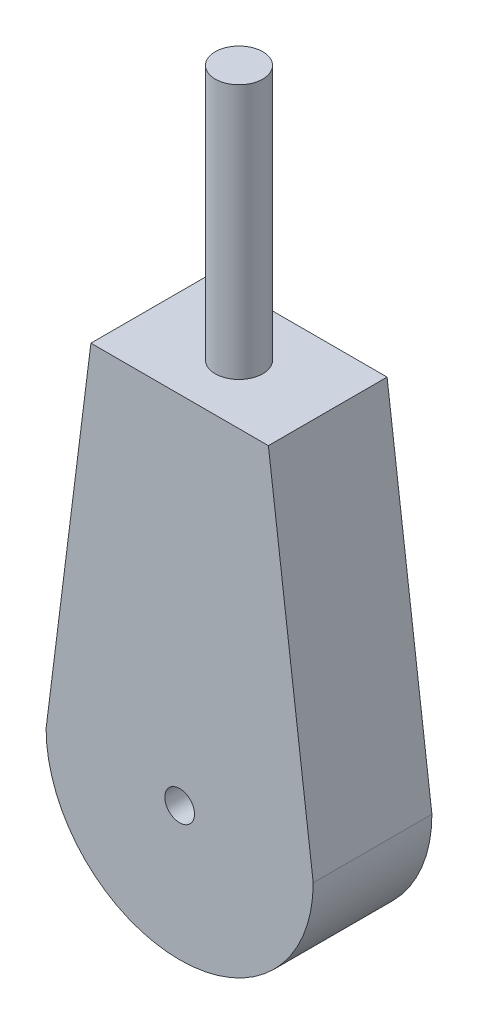
ISO-10303-21;
HEADER;
FILE_DESCRIPTION(('STEP AP214'),'2;1');
FILE_NAME('part.step','',(''),(''),'','','');
FILE_SCHEMA(('AUTOMOTIVE_DESIGN { 1 0 10303 214 1 1 1 1 }'));
ENDSEC;
DATA;
#1=APPLICATION_CONTEXT('core data for automotive mechanical design processes');
#2=APPLICATION_PROTOCOL_DEFINITION('international standard','automotive_design',2000,#1);
#3=PRODUCT_CONTEXT('',#1,'mechanical');
#4=PRODUCT('Part','Part','',(#3));
#5=PRODUCT_RELATED_PRODUCT_CATEGORY('part','',(#4));
#6=PRODUCT_DEFINITION_FORMATION('','',#4);
#7=PRODUCT_DEFINITION_CONTEXT('part definition',#1,'design');
#8=PRODUCT_DEFINITION('design','',#6,#7);
#9=PRODUCT_DEFINITION_SHAPE('','',#8);
#10=(LENGTH_UNIT() NAMED_UNIT(*) SI_UNIT(.MILLI.,.METRE.));
#11=(NAMED_UNIT(*) PLANE_ANGLE_UNIT() SI_UNIT($,.RADIAN.));
#12=(NAMED_UNIT(*) SI_UNIT($,.STERADIAN.) SOLID_ANGLE_UNIT());
#13=UNCERTAINTY_MEASURE_WITH_UNIT(LENGTH_MEASURE(1.E-05),#10,'distance_accuracy_value','');
#14=(GEOMETRIC_REPRESENTATION_CONTEXT(3) GLOBAL_UNCERTAINTY_ASSIGNED_CONTEXT((#13)) GLOBAL_UNIT_ASSIGNED_CONTEXT((#10,
#11,#12)) REPRESENTATION_CONTEXT('',''));
#15=CARTESIAN_POINT('',(0.,0.,0.));
#16=DIRECTION('',(0.,0.,1.));
#17=DIRECTION('',(1.,0.,0.));
#18=AXIS2_PLACEMENT_3D('',#15,#16,#17);
#19=CARTESIAN_POINT('',(0.,0.,10.));
#20=DIRECTION('',(0.,0.,-1.));
#21=DIRECTION('',(-1.,0.,0.));
#22=AXIS2_PLACEMENT_3D('',#19,#20,#21);
#23=CYLINDRICAL_SURFACE('',#22,22.5);
#24=CARTESIAN_POINT('',(0.,0.,-10.));
#25=DIRECTION('',(0.,0.,1.));
#26=DIRECTION('',(1.,0.,0.));
#27=AXIS2_PLACEMENT_3D('',#24,#25,#26);
#28=CIRCLE('',#27,22.5);
#29=CARTESIAN_POINT('',(-22.5,0.,-10.));
#30=VERTEX_POINT('',#29);
#31=CARTESIAN_POINT('',(22.5,0.,-10.));
#32=VERTEX_POINT('',#31);
#33=EDGE_CURVE('E101',#30,#32,#28,.T.);
#34=ORIENTED_EDGE('',*,*,#33,.T.);
#35=DIRECTION('',(0.,0.,-1.));
#36=VECTOR('',#35,1.);
#37=CARTESIAN_POINT('',(22.5,0.,10.));
#38=LINE('',#37,#36);
#39=CARTESIAN_POINT('',(22.5,0.,10.));
#40=VERTEX_POINT('',#39);
#41=EDGE_CURVE('E92',#40,#32,#38,.T.);
#42=ORIENTED_EDGE('',*,*,#41,.F.);
#43=CARTESIAN_POINT('',(0.,0.,10.));
#44=DIRECTION('',(0.,0.,1.));
#45=DIRECTION('',(1.,0.,0.));
#46=AXIS2_PLACEMENT_3D('',#43,#44,#45);
#47=CIRCLE('',#46,22.5);
#48=CARTESIAN_POINT('',(-22.5,0.,10.));
#49=VERTEX_POINT('',#48);
#50=EDGE_CURVE('E86',#49,#40,#47,.T.);
#51=ORIENTED_EDGE('',*,*,#50,.F.);
#52=DIRECTION('',(0.,0.,-1.));
#53=VECTOR('',#52,1.);
#54=CARTESIAN_POINT('',(-22.5,0.,10.));
#55=LINE('',#54,#53);
#56=EDGE_CURVE('E97',#49,#30,#55,.T.);
#57=ORIENTED_EDGE('',*,*,#56,.T.);
#58=EDGE_LOOP('',(#34,#42,#51,#57));
#59=FACE_BOUND('',#58,.T.);
#60=ADVANCED_FACE('F34',(#59),#23,.T.);
#61=CARTESIAN_POINT('',(22.5,0.,10.));
#62=DIRECTION('',(-0.992175781142546,-0.12484878579377,0.));
#63=DIRECTION('',(0.12484878579377,-0.992175781142546,0.));
#64=AXIS2_PLACEMENT_3D('',#61,#62,#63);
#65=PLANE('',#64);
#66=DIRECTION('',(-0.12484878579377,0.992175781142546,0.));
#67=VECTOR('',#66,1.);
#68=CARTESIAN_POINT('',(22.5,0.,-10.));
#69=LINE('',#68,#67);
#70=CARTESIAN_POINT('',(14.95,60.,-10.));
#71=VERTEX_POINT('',#70);
#72=EDGE_CURVE('E91',#32,#71,#69,.T.);
#73=ORIENTED_EDGE('',*,*,#72,.T.);
#74=DIRECTION('',(0.,0.,-1.));
#75=VECTOR('',#74,1.);
#76=CARTESIAN_POINT('',(14.95,60.,10.));
#77=LINE('',#76,#75);
#78=CARTESIAN_POINT('',(14.95,60.,10.));
#79=VERTEX_POINT('',#78);
#80=EDGE_CURVE('E89',#79,#71,#77,.T.);
#81=ORIENTED_EDGE('',*,*,#80,.F.);
#82=DIRECTION('',(-0.12484878579377,0.992175781142546,0.));
#83=VECTOR('',#82,1.);
#84=CARTESIAN_POINT('',(22.5,0.,10.));
#85=LINE('',#84,#83);
#86=EDGE_CURVE('E81',#40,#79,#85,.T.);
#87=ORIENTED_EDGE('',*,*,#86,.F.);
#88=ORIENTED_EDGE('',*,*,#41,.T.);
#89=EDGE_LOOP('',(#73,#81,#87,#88));
#90=FACE_BOUND('',#89,.T.);
#91=ADVANCED_FACE('F90',(#90),#65,.F.);
#92=CARTESIAN_POINT('',(-14.95,60.,10.));
#93=DIRECTION('',(0.,-1.,0.));
#94=DIRECTION('',(0.,0.,-1.));
#95=AXIS2_PLACEMENT_3D('',#92,#93,#94);
#96=PLANE('',#95);
#97=CARTESIAN_POINT('',(0.,60.,0.));
#98=DIRECTION('',(0.,1.,0.));
#99=DIRECTION('',(0.,0.,1.));
#100=AXIS2_PLACEMENT_3D('',#97,#98,#99);
#101=CIRCLE('',#100,4.);
#102=CARTESIAN_POINT('',(0.,60.,4.));
#103=VERTEX_POINT('',#102);
#104=EDGE_CURVE('E42',#103,#103,#101,.T.);
#105=ORIENTED_EDGE('',*,*,#104,.F.);
#106=EDGE_LOOP('',(#105));
#107=FACE_BOUND('',#106,.T.);
#108=DIRECTION('',(-1.,0.,0.));
#109=VECTOR('',#108,1.);
#110=CARTESIAN_POINT('',(-14.95,60.,-10.));
#111=LINE('',#110,#109);
#112=CARTESIAN_POINT('',(-14.95,60.,-10.));
#113=VERTEX_POINT('',#112);
#114=EDGE_CURVE('E67',#71,#113,#111,.T.);
#115=ORIENTED_EDGE('',*,*,#114,.T.);
#116=DIRECTION('',(0.,0.,-1.));
#117=VECTOR('',#116,1.);
#118=CARTESIAN_POINT('',(-14.95,60.,10.));
#119=LINE('',#118,#117);
#120=CARTESIAN_POINT('',(-14.95,60.,10.));
#121=VERTEX_POINT('',#120);
#122=EDGE_CURVE('E93',#121,#113,#119,.T.);
#123=ORIENTED_EDGE('',*,*,#122,.F.);
#124=DIRECTION('',(-1.,0.,0.));
#125=VECTOR('',#124,1.);
#126=CARTESIAN_POINT('',(-14.95,60.,10.));
#127=LINE('',#126,#125);
#128=EDGE_CURVE('E84',#79,#121,#127,.T.);
#129=ORIENTED_EDGE('',*,*,#128,.F.);
#130=ORIENTED_EDGE('',*,*,#80,.T.);
#131=EDGE_LOOP('',(#115,#123,#129,#130));
#132=FACE_BOUND('',#131,.T.);
#133=ADVANCED_FACE('F95',(#107,#132),#96,.F.);
#134=CARTESIAN_POINT('',(-22.5,0.,10.));
#135=DIRECTION('',(0.992175781142546,-0.12484878579377,0.));
#136=DIRECTION('',(0.12484878579377,0.992175781142546,0.));
#137=AXIS2_PLACEMENT_3D('',#134,#135,#136);
#138=PLANE('',#137);
#139=DIRECTION('',(-0.12484878579377,-0.992175781142546,0.));
#140=VECTOR('',#139,1.);
#141=CARTESIAN_POINT('',(-22.5,0.,-10.));
#142=LINE('',#141,#140);
#143=EDGE_CURVE('E73',#113,#30,#142,.T.);
#144=ORIENTED_EDGE('',*,*,#143,.T.);
#145=ORIENTED_EDGE('',*,*,#56,.F.);
#146=DIRECTION('',(-0.12484878579377,-0.992175781142546,0.));
#147=VECTOR('',#146,1.);
#148=CARTESIAN_POINT('',(-22.5,0.,10.));
#149=LINE('',#148,#147);
#150=EDGE_CURVE('E50',#121,#49,#149,.T.);
#151=ORIENTED_EDGE('',*,*,#150,.F.);
#152=ORIENTED_EDGE('',*,*,#122,.T.);
#153=EDGE_LOOP('',(#144,#145,#151,#152));
#154=FACE_BOUND('',#153,.T.);
#155=ADVANCED_FACE('F160',(#154),#138,.F.);
#156=CARTESIAN_POINT('',(0.,0.,10.));
#157=DIRECTION('',(0.,0.,1.));
#158=DIRECTION('',(1.,0.,0.));
#159=AXIS2_PLACEMENT_3D('',#156,#157,#158);
#160=PLANE('',#159);
#161=CARTESIAN_POINT('',(0.,0.,10.));
#162=DIRECTION('',(0.,0.,1.));
#163=DIRECTION('',(1.,0.,0.));
#164=AXIS2_PLACEMENT_3D('',#161,#162,#163);
#165=CIRCLE('',#164,2.5);
#166=CARTESIAN_POINT('',(2.5,0.,10.));
#167=VERTEX_POINT('',#166);
#168=EDGE_CURVE('E117',#167,#167,#165,.T.);
#169=ORIENTED_EDGE('',*,*,#168,.F.);
#170=EDGE_LOOP('',(#169));
#171=FACE_BOUND('',#170,.T.);
#172=ORIENTED_EDGE('',*,*,#50,.T.);
#173=ORIENTED_EDGE('',*,*,#86,.T.);
#174=ORIENTED_EDGE('',*,*,#128,.T.);
#175=ORIENTED_EDGE('',*,*,#150,.T.);
#176=EDGE_LOOP('',(#172,#173,#174,#175));
#177=FACE_BOUND('',#176,.T.);
#178=ADVANCED_FACE('F82',(#171,#177),#160,.T.);
#179=CARTESIAN_POINT('',(0.,0.,-10.));
#180=DIRECTION('',(0.,0.,1.));
#181=DIRECTION('',(1.,0.,0.));
#182=AXIS2_PLACEMENT_3D('',#179,#180,#181);
#183=PLANE('',#182);
#184=CARTESIAN_POINT('',(0.,0.,-10.));
#185=DIRECTION('',(0.,0.,1.));
#186=DIRECTION('',(1.,0.,0.));
#187=AXIS2_PLACEMENT_3D('',#184,#185,#186);
#188=CIRCLE('',#187,12.5);
#189=CARTESIAN_POINT('',(12.5,0.,-10.));
#190=VERTEX_POINT('',#189);
#191=EDGE_CURVE('E11',#190,#190,#188,.F.);
#192=ORIENTED_EDGE('',*,*,#191,.F.);
#193=EDGE_LOOP('',(#192));
#194=FACE_BOUND('',#193,.T.);
#195=ORIENTED_EDGE('',*,*,#33,.F.);
#196=ORIENTED_EDGE('',*,*,#143,.F.);
#197=ORIENTED_EDGE('',*,*,#114,.F.);
#198=ORIENTED_EDGE('',*,*,#72,.F.);
#199=EDGE_LOOP('',(#195,#196,#197,#198));
#200=FACE_BOUND('',#199,.T.);
#201=ADVANCED_FACE('F153',(#194,#200),#183,.F.);
#202=CARTESIAN_POINT('',(0.,103.,0.));
#203=DIRECTION('',(0.,-1.,0.));
#204=DIRECTION('',(0.,0.,-1.));
#205=AXIS2_PLACEMENT_3D('',#202,#203,#204);
#206=CYLINDRICAL_SURFACE('',#205,4.);
#207=CARTESIAN_POINT('',(0.,103.,0.));
#208=DIRECTION('',(0.,1.,0.));
#209=DIRECTION('',(0.,0.,1.));
#210=AXIS2_PLACEMENT_3D('',#207,#208,#209);
#211=CIRCLE('',#210,4.);
#212=CARTESIAN_POINT('',(0.,103.,4.));
#213=VERTEX_POINT('',#212);
#214=EDGE_CURVE('E104',#213,#213,#211,.T.);
#215=ORIENTED_EDGE('',*,*,#214,.F.);
#216=EDGE_LOOP('',(#215));
#217=FACE_BOUND('',#216,.T.);
#218=ORIENTED_EDGE('',*,*,#104,.T.);
#219=EDGE_LOOP('',(#218));
#220=FACE_BOUND('',#219,.T.);
#221=ADVANCED_FACE('F156',(#217,#220),#206,.T.);
#222=CARTESIAN_POINT('',(0.,103.,0.));
#223=DIRECTION('',(0.,1.,0.));
#224=DIRECTION('',(0.,0.,1.));
#225=AXIS2_PLACEMENT_3D('',#222,#223,#224);
#226=PLANE('',#225);
#227=ORIENTED_EDGE('',*,*,#214,.T.);
#228=EDGE_LOOP('',(#227));
#229=FACE_BOUND('',#228,.T.);
#230=ADVANCED_FACE('F192',(#229),#226,.T.);
#231=CARTESIAN_POINT('',(0.,0.,5.));
#232=DIRECTION('',(0.,0.,1.));
#233=DIRECTION('',(1.,0.,0.));
#234=AXIS2_PLACEMENT_3D('',#231,#232,#233);
#235=CYLINDRICAL_SURFACE('',#234,2.5);
#236=CARTESIAN_POINT('',(0.,0.,5.));
#237=DIRECTION('',(0.,0.,1.));
#238=DIRECTION('',(1.,0.,0.));
#239=AXIS2_PLACEMENT_3D('',#236,#237,#238);
#240=CIRCLE('',#239,2.5);
#241=CARTESIAN_POINT('',(2.5,0.,5.));
#242=VERTEX_POINT('',#241);
#243=EDGE_CURVE('E116',#242,#242,#240,.T.);
#244=ORIENTED_EDGE('',*,*,#243,.F.);
#245=EDGE_LOOP('',(#244));
#246=FACE_BOUND('',#245,.T.);
#247=ORIENTED_EDGE('',*,*,#168,.T.);
#248=EDGE_LOOP('',(#247));
#249=FACE_BOUND('',#248,.T.);
#250=ADVANCED_FACE('F203',(#246,#249),#235,.F.);
#251=CARTESIAN_POINT('',(0.,0.,5.));
#252=DIRECTION('',(0.,0.,1.));
#253=DIRECTION('',(1.,0.,0.));
#254=AXIS2_PLACEMENT_3D('',#251,#252,#253);
#255=PLANE('',#254);
#256=ORIENTED_EDGE('',*,*,#243,.T.);
#257=EDGE_LOOP('',(#256));
#258=FACE_BOUND('',#257,.T.);
#259=ADVANCED_FACE('F149',(#258),#255,.T.);
#260=CARTESIAN_POINT('',(0.,0.,-15.));
#261=DIRECTION('',(0.,0.,1.));
#262=DIRECTION('',(1.,0.,0.));
#263=AXIS2_PLACEMENT_3D('',#260,#261,#262);
#264=CYLINDRICAL_SURFACE('',#263,12.5);
#265=CARTESIAN_POINT('',(0.,0.,-15.));
#266=DIRECTION('',(0.,0.,-1.));
#267=DIRECTION('',(-1.,0.,0.));
#268=AXIS2_PLACEMENT_3D('',#265,#266,#267);
#269=CIRCLE('',#268,12.5);
#270=CARTESIAN_POINT('',(-12.5,0.,-15.));
#271=VERTEX_POINT('',#270);
#272=EDGE_CURVE('E120',#271,#271,#269,.T.);
#273=ORIENTED_EDGE('',*,*,#272,.F.);
#274=EDGE_LOOP('',(#273));
#275=FACE_BOUND('',#274,.T.);
#276=ORIENTED_EDGE('',*,*,#191,.T.);
#277=EDGE_LOOP('',(#276));
#278=FACE_BOUND('',#277,.T.);
#279=ADVANCED_FACE('F143',(#275,#278),#264,.T.);
#280=CARTESIAN_POINT('',(0.,0.,-15.));
#281=DIRECTION('',(0.,0.,-1.));
#282=DIRECTION('',(-1.,0.,0.));
#283=AXIS2_PLACEMENT_3D('',#280,#281,#282);
#284=PLANE('',#283);
#285=CARTESIAN_POINT('',(0.,0.,-15.));
#286=DIRECTION('',(0.,0.,-1.));
#287=DIRECTION('',(-1.,0.,0.));
#288=AXIS2_PLACEMENT_3D('',#285,#286,#287);
#289=CIRCLE('',#288,2.5);
#290=CARTESIAN_POINT('',(-2.5,0.,-15.));
#291=VERTEX_POINT('',#290);
#292=EDGE_CURVE('E126',#291,#291,#289,.T.);
#293=ORIENTED_EDGE('',*,*,#292,.F.);
#294=EDGE_LOOP('',(#293));
#295=FACE_BOUND('',#294,.T.);
#296=ORIENTED_EDGE('',*,*,#272,.T.);
#297=EDGE_LOOP('',(#296));
#298=FACE_BOUND('',#297,.T.);
#299=ADVANCED_FACE('F137',(#295,#298),#284,.T.);
#300=CARTESIAN_POINT('',(0.,0.,-10.));
#301=DIRECTION('',(0.,0.,-1.));
#302=DIRECTION('',(-1.,0.,0.));
#303=AXIS2_PLACEMENT_3D('',#300,#301,#302);
#304=CYLINDRICAL_SURFACE('',#303,2.5);
#305=CARTESIAN_POINT('',(0.,0.,-10.));
#306=DIRECTION('',(0.,0.,-1.));
#307=DIRECTION('',(-1.,0.,0.));
#308=AXIS2_PLACEMENT_3D('',#305,#306,#307);
#309=CIRCLE('',#308,2.5);
#310=CARTESIAN_POINT('',(-2.5,0.,-10.));
#311=VERTEX_POINT('',#310);
#312=EDGE_CURVE('E125',#311,#311,#309,.T.);
#313=ORIENTED_EDGE('',*,*,#312,.F.);
#314=EDGE_LOOP('',(#313));
#315=FACE_BOUND('',#314,.T.);
#316=ORIENTED_EDGE('',*,*,#292,.T.);
#317=EDGE_LOOP('',(#316));
#318=FACE_BOUND('',#317,.T.);
#319=ADVANCED_FACE('F134',(#315,#318),#304,.F.);
#320=CARTESIAN_POINT('',(0.,0.,-10.));
#321=DIRECTION('',(0.,0.,-1.));
#322=DIRECTION('',(-1.,0.,0.));
#323=AXIS2_PLACEMENT_3D('',#320,#321,#322);
#324=PLANE('',#323);
#325=ORIENTED_EDGE('',*,*,#312,.T.);
#326=EDGE_LOOP('',(#325));
#327=FACE_BOUND('',#326,.T.);
#328=ADVANCED_FACE('F132',(#327),#324,.T.);
#329=CLOSED_SHELL('',(#60,#91,#133,#155,#178,#201,#221,#230,#250,#259,#279,#299,#319,#328));
#330=MANIFOLD_SOLID_BREP('B2',#329);
#331=ADVANCED_BREP_SHAPE_REPRESENTATION('',(#18,#330),#14);
#332=SHAPE_DEFINITION_REPRESENTATION(#9,#331);
ENDSEC;
END-ISO-10303-21;
